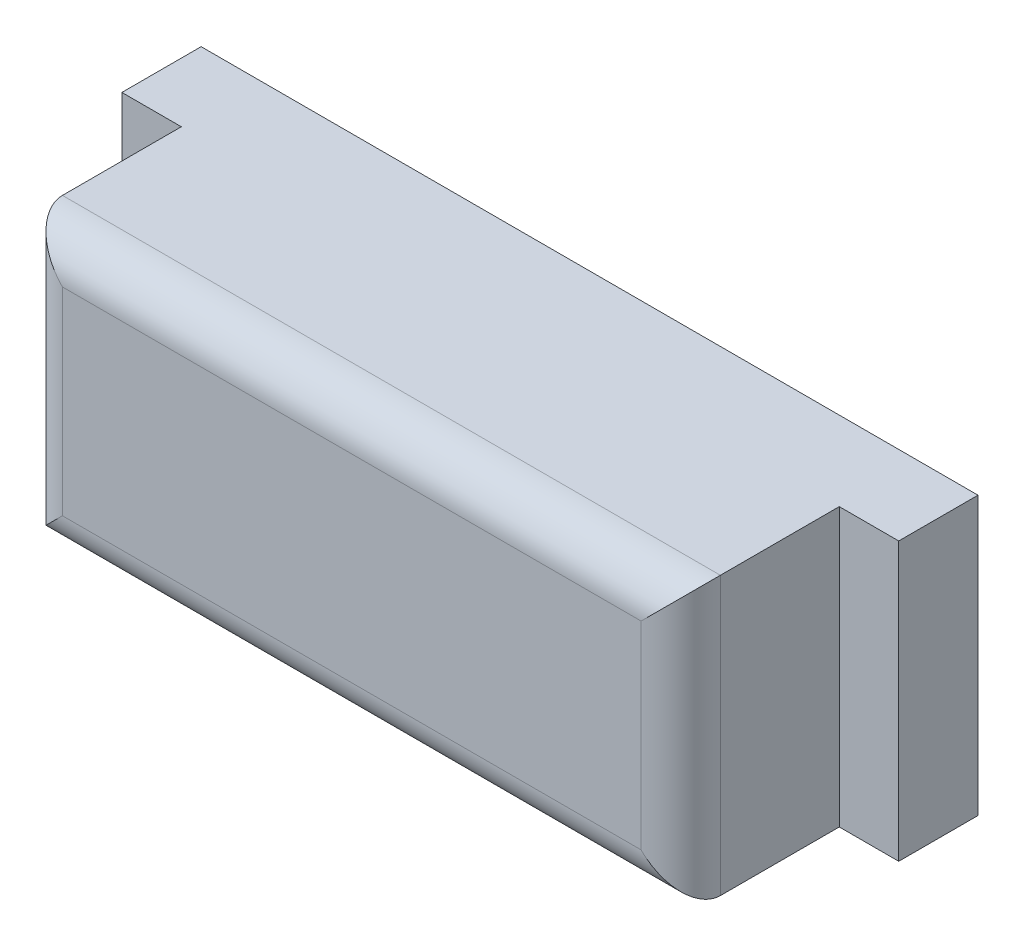
ISO-10303-21;
HEADER;
FILE_DESCRIPTION(('STEP AP214'),'2;1');
FILE_NAME('part.step','',(''),(''),'','','');
FILE_SCHEMA(('AUTOMOTIVE_DESIGN { 1 0 10303 214 1 1 1 1 }'));
ENDSEC;
DATA;
#1=APPLICATION_CONTEXT('core data for automotive mechanical design processes');
#2=APPLICATION_PROTOCOL_DEFINITION('international standard','automotive_design',2000,#1);
#3=PRODUCT_CONTEXT('',#1,'mechanical');
#4=PRODUCT('Part','Part','',(#3));
#5=PRODUCT_RELATED_PRODUCT_CATEGORY('part','',(#4));
#6=PRODUCT_DEFINITION_FORMATION('','',#4);
#7=PRODUCT_DEFINITION_CONTEXT('part definition',#1,'design');
#8=PRODUCT_DEFINITION('design','',#6,#7);
#9=PRODUCT_DEFINITION_SHAPE('','',#8);
#10=(LENGTH_UNIT() NAMED_UNIT(*) SI_UNIT(.MILLI.,.METRE.));
#11=(NAMED_UNIT(*) PLANE_ANGLE_UNIT() SI_UNIT($,.RADIAN.));
#12=(NAMED_UNIT(*) SI_UNIT($,.STERADIAN.) SOLID_ANGLE_UNIT());
#13=UNCERTAINTY_MEASURE_WITH_UNIT(LENGTH_MEASURE(1.E-05),#10,'distance_accuracy_value','');
#14=(GEOMETRIC_REPRESENTATION_CONTEXT(3) GLOBAL_UNCERTAINTY_ASSIGNED_CONTEXT((#13)) GLOBAL_UNIT_ASSIGNED_CONTEXT((#10,
#11,#12)) REPRESENTATION_CONTEXT('',''));
#15=CARTESIAN_POINT('',(0.,0.,0.));
#16=DIRECTION('',(0.,0.,1.));
#17=DIRECTION('',(1.,0.,0.));
#18=AXIS2_PLACEMENT_3D('',#15,#16,#17);
#19=CARTESIAN_POINT('',(0.,0.,1.));
#20=DIRECTION('',(0.,0.,1.));
#21=DIRECTION('',(1.,0.,0.));
#22=AXIS2_PLACEMENT_3D('',#19,#20,#21);
#23=PLANE('',#22);
#24=DIRECTION('',(0.,1.,0.));
#25=VECTOR('',#24,1.);
#26=CARTESIAN_POINT('',(4.15,1.75,1.));
#27=LINE('',#26,#25);
#28=CARTESIAN_POINT('',(4.15,-1.75,1.));
#29=VERTEX_POINT('',#28);
#30=CARTESIAN_POINT('',(4.15,1.75,1.));
#31=VERTEX_POINT('',#30);
#32=EDGE_CURVE('E146',#29,#31,#27,.T.);
#33=ORIENTED_EDGE('',*,*,#32,.F.);
#34=DIRECTION('',(1.,0.,0.));
#35=VECTOR('',#34,1.);
#36=CARTESIAN_POINT('',(-4.9,-1.75,1.));
#37=LINE('',#36,#35);
#38=CARTESIAN_POINT('',(4.9,-1.75,1.));
#39=VERTEX_POINT('',#38);
#40=EDGE_CURVE('E142',#29,#39,#37,.T.);
#41=ORIENTED_EDGE('',*,*,#40,.T.);
#42=DIRECTION('',(0.,1.,0.));
#43=VECTOR('',#42,1.);
#44=CARTESIAN_POINT('',(4.9,1.75,1.));
#45=LINE('',#44,#43);
#46=CARTESIAN_POINT('',(4.9,1.75,1.));
#47=VERTEX_POINT('',#46);
#48=EDGE_CURVE('E160',#39,#47,#45,.T.);
#49=ORIENTED_EDGE('',*,*,#48,.T.);
#50=DIRECTION('',(-1.,0.,0.));
#51=VECTOR('',#50,1.);
#52=CARTESIAN_POINT('',(-4.9,1.75,1.));
#53=LINE('',#52,#51);
#54=EDGE_CURVE('E166',#47,#31,#53,.T.);
#55=ORIENTED_EDGE('',*,*,#54,.T.);
#56=EDGE_LOOP('',(#33,#41,#49,#55));
#57=FACE_BOUND('',#56,.T.);
#58=ADVANCED_FACE('F39',(#57),#23,.T.);
#59=CARTESIAN_POINT('',(4.9,1.75,1.));
#60=DIRECTION('',(-1.,0.,0.));
#61=DIRECTION('',(0.,-1.,0.));
#62=AXIS2_PLACEMENT_3D('',#59,#60,#61);
#63=PLANE('',#62);
#64=DIRECTION('',(0.,1.,0.));
#65=VECTOR('',#64,1.);
#66=CARTESIAN_POINT('',(4.9,1.75,0.));
#67=LINE('',#66,#65);
#68=CARTESIAN_POINT('',(4.9,-1.75,0.));
#69=VERTEX_POINT('',#68);
#70=CARTESIAN_POINT('',(4.9,1.75,0.));
#71=VERTEX_POINT('',#70);
#72=EDGE_CURVE('E159',#69,#71,#67,.T.);
#73=ORIENTED_EDGE('',*,*,#72,.T.);
#74=DIRECTION('',(0.,0.,-1.));
#75=VECTOR('',#74,1.);
#76=CARTESIAN_POINT('',(4.9,1.75,1.));
#77=LINE('',#76,#75);
#78=EDGE_CURVE('E193',#47,#71,#77,.T.);
#79=ORIENTED_EDGE('',*,*,#78,.F.);
#80=ORIENTED_EDGE('',*,*,#48,.F.);
#81=DIRECTION('',(0.,0.,-1.));
#82=VECTOR('',#81,1.);
#83=CARTESIAN_POINT('',(4.9,-1.75,1.));
#84=LINE('',#83,#82);
#85=EDGE_CURVE('E141',#39,#69,#84,.T.);
#86=ORIENTED_EDGE('',*,*,#85,.T.);
#87=EDGE_LOOP('',(#73,#79,#80,#86));
#88=FACE_BOUND('',#87,.T.);
#89=ADVANCED_FACE('F255',(#88),#63,.F.);
#90=CARTESIAN_POINT('',(-4.9,1.75,1.));
#91=DIRECTION('',(0.,-1.,0.));
#92=DIRECTION('',(0.,0.,-1.));
#93=AXIS2_PLACEMENT_3D('',#90,#91,#92);
#94=PLANE('',#93);
#95=DIRECTION('',(0.,0.,-1.));
#96=VECTOR('',#95,1.);
#97=CARTESIAN_POINT('',(-4.15,1.75,3.));
#98=LINE('',#97,#96);
#99=CARTESIAN_POINT('',(-4.15,1.75,2.5));
#100=VERTEX_POINT('',#99);
#101=CARTESIAN_POINT('',(-4.15,1.75,1.));
#102=VERTEX_POINT('',#101);
#103=EDGE_CURVE('E129',#100,#102,#98,.T.);
#104=ORIENTED_EDGE('',*,*,#103,.F.);
#105=DIRECTION('',(-1.,0.,0.));
#106=VECTOR('',#105,1.);
#107=CARTESIAN_POINT('',(4.15,1.75,2.5));
#108=LINE('',#107,#106);
#109=CARTESIAN_POINT('',(4.15,1.75,2.5));
#110=VERTEX_POINT('',#109);
#111=EDGE_CURVE('E49',#100,#110,#108,.F.);
#112=ORIENTED_EDGE('',*,*,#111,.T.);
#113=DIRECTION('',(0.,0.,-1.));
#114=VECTOR('',#113,1.);
#115=CARTESIAN_POINT('',(4.15,1.75,3.));
#116=LINE('',#115,#114);
#117=EDGE_CURVE('E156',#110,#31,#116,.T.);
#118=ORIENTED_EDGE('',*,*,#117,.T.);
#119=ORIENTED_EDGE('',*,*,#54,.F.);
#120=ORIENTED_EDGE('',*,*,#78,.T.);
#121=DIRECTION('',(-1.,0.,0.));
#122=VECTOR('',#121,1.);
#123=CARTESIAN_POINT('',(-4.9,1.75,0.));
#124=LINE('',#123,#122);
#125=CARTESIAN_POINT('',(-4.9,1.75,0.));
#126=VERTEX_POINT('',#125);
#127=EDGE_CURVE('E175',#71,#126,#124,.T.);
#128=ORIENTED_EDGE('',*,*,#127,.T.);
#129=DIRECTION('',(0.,0.,-1.));
#130=VECTOR('',#129,1.);
#131=CARTESIAN_POINT('',(-4.9,1.75,1.));
#132=LINE('',#131,#130);
#133=CARTESIAN_POINT('',(-4.9,1.75,1.));
#134=VERTEX_POINT('',#133);
#135=EDGE_CURVE('E189',#134,#126,#132,.T.);
#136=ORIENTED_EDGE('',*,*,#135,.F.);
#137=EDGE_CURVE('E164',#102,#134,#53,.T.);
#138=ORIENTED_EDGE('',*,*,#137,.F.);
#139=EDGE_LOOP('',(#104,#112,#118,#119,#120,#128,#136,#138));
#140=FACE_BOUND('',#139,.T.);
#141=ADVANCED_FACE('F242',(#140),#94,.F.);
#142=CARTESIAN_POINT('',(-4.9,1.75,1.));
#143=DIRECTION('',(1.,0.,0.));
#144=DIRECTION('',(0.,0.,-1.));
#145=AXIS2_PLACEMENT_3D('',#142,#143,#144);
#146=PLANE('',#145);
#147=DIRECTION('',(0.,-1.,0.));
#148=VECTOR('',#147,1.);
#149=CARTESIAN_POINT('',(-4.9,1.75,0.));
#150=LINE('',#149,#148);
#151=CARTESIAN_POINT('',(-4.9,-1.75,0.));
#152=VERTEX_POINT('',#151);
#153=EDGE_CURVE('E178',#126,#152,#150,.T.);
#154=ORIENTED_EDGE('',*,*,#153,.T.);
#155=DIRECTION('',(0.,0.,-1.));
#156=VECTOR('',#155,1.);
#157=CARTESIAN_POINT('',(-4.9,-1.75,1.));
#158=LINE('',#157,#156);
#159=CARTESIAN_POINT('',(-4.9,-1.75,1.));
#160=VERTEX_POINT('',#159);
#161=EDGE_CURVE('E186',#160,#152,#158,.T.);
#162=ORIENTED_EDGE('',*,*,#161,.F.);
#163=DIRECTION('',(0.,-1.,0.));
#164=VECTOR('',#163,1.);
#165=CARTESIAN_POINT('',(-4.9,1.75,1.));
#166=LINE('',#165,#164);
#167=EDGE_CURVE('E138',#134,#160,#166,.T.);
#168=ORIENTED_EDGE('',*,*,#167,.F.);
#169=ORIENTED_EDGE('',*,*,#135,.T.);
#170=EDGE_LOOP('',(#154,#162,#168,#169));
#171=FACE_BOUND('',#170,.T.);
#172=ADVANCED_FACE('F278',(#171),#146,.F.);
#173=CARTESIAN_POINT('',(-4.9,-1.75,1.));
#174=DIRECTION('',(0.,1.,0.));
#175=DIRECTION('',(0.,0.,1.));
#176=AXIS2_PLACEMENT_3D('',#173,#174,#175);
#177=PLANE('',#176);
#178=DIRECTION('',(0.,0.,-1.));
#179=VECTOR('',#178,1.);
#180=CARTESIAN_POINT('',(4.15,-1.75,3.));
#181=LINE('',#180,#179);
#182=CARTESIAN_POINT('',(4.15,-1.75,2.5));
#183=VERTEX_POINT('',#182);
#184=EDGE_CURVE('E130',#183,#29,#181,.T.);
#185=ORIENTED_EDGE('',*,*,#184,.F.);
#186=DIRECTION('',(1.,0.,0.));
#187=VECTOR('',#186,1.);
#188=CARTESIAN_POINT('',(-4.15,-1.75,2.5));
#189=LINE('',#188,#187);
#190=CARTESIAN_POINT('',(-4.15,-1.75,2.5));
#191=VERTEX_POINT('',#190);
#192=EDGE_CURVE('E123',#183,#191,#189,.F.);
#193=ORIENTED_EDGE('',*,*,#192,.T.);
#194=DIRECTION('',(0.,0.,-1.));
#195=VECTOR('',#194,1.);
#196=CARTESIAN_POINT('',(-4.15,-1.75,3.));
#197=LINE('',#196,#195);
#198=CARTESIAN_POINT('',(-4.15,-1.75,1.));
#199=VERTEX_POINT('',#198);
#200=EDGE_CURVE('E117',#191,#199,#197,.T.);
#201=ORIENTED_EDGE('',*,*,#200,.T.);
#202=EDGE_CURVE('E121',#160,#199,#37,.T.);
#203=ORIENTED_EDGE('',*,*,#202,.F.);
#204=ORIENTED_EDGE('',*,*,#161,.T.);
#205=DIRECTION('',(1.,0.,0.));
#206=VECTOR('',#205,1.);
#207=CARTESIAN_POINT('',(-4.9,-1.75,0.));
#208=LINE('',#207,#206);
#209=EDGE_CURVE('E165',#152,#69,#208,.T.);
#210=ORIENTED_EDGE('',*,*,#209,.T.);
#211=ORIENTED_EDGE('',*,*,#85,.F.);
#212=ORIENTED_EDGE('',*,*,#40,.F.);
#213=EDGE_LOOP('',(#185,#193,#201,#203,#204,#210,#211,#212));
#214=FACE_BOUND('',#213,.T.);
#215=ADVANCED_FACE('F119',(#214),#177,.F.);
#216=DIRECTION('',(0.,-1.,0.));
#217=VECTOR('',#216,1.);
#218=CARTESIAN_POINT('',(-4.15,1.75,1.));
#219=LINE('',#218,#217);
#220=EDGE_CURVE('E135',#102,#199,#219,.T.);
#221=ORIENTED_EDGE('',*,*,#220,.F.);
#222=ORIENTED_EDGE('',*,*,#137,.T.);
#223=ORIENTED_EDGE('',*,*,#167,.T.);
#224=ORIENTED_EDGE('',*,*,#202,.T.);
#225=EDGE_LOOP('',(#221,#222,#223,#224));
#226=FACE_BOUND('',#225,.T.);
#227=ADVANCED_FACE('F134',(#226),#23,.T.);
#228=CARTESIAN_POINT('',(0.,0.,0.));
#229=DIRECTION('',(0.,0.,1.));
#230=DIRECTION('',(1.,0.,0.));
#231=AXIS2_PLACEMENT_3D('',#228,#229,#230);
#232=PLANE('',#231);
#233=ORIENTED_EDGE('',*,*,#72,.F.);
#234=ORIENTED_EDGE('',*,*,#209,.F.);
#235=ORIENTED_EDGE('',*,*,#153,.F.);
#236=ORIENTED_EDGE('',*,*,#127,.F.);
#237=EDGE_LOOP('',(#233,#234,#235,#236));
#238=FACE_BOUND('',#237,.T.);
#239=ADVANCED_FACE('F258',(#238),#232,.F.);
#240=CARTESIAN_POINT('',(4.15,1.75,3.));
#241=DIRECTION('',(-1.,0.,0.));
#242=DIRECTION('',(0.,0.,1.));
#243=AXIS2_PLACEMENT_3D('',#240,#241,#242);
#244=PLANE('',#243);
#245=ORIENTED_EDGE('',*,*,#117,.F.);
#246=DIRECTION('',(0.,1.,0.));
#247=VECTOR('',#246,1.);
#248=CARTESIAN_POINT('',(4.15,-1.75,2.5));
#249=LINE('',#248,#247);
#250=EDGE_CURVE('E11',#110,#183,#249,.F.);
#251=ORIENTED_EDGE('',*,*,#250,.T.);
#252=ORIENTED_EDGE('',*,*,#184,.T.);
#253=ORIENTED_EDGE('',*,*,#32,.T.);
#254=EDGE_LOOP('',(#245,#251,#252,#253));
#255=FACE_BOUND('',#254,.T.);
#256=ADVANCED_FACE('F256',(#255),#244,.F.);
#257=CARTESIAN_POINT('',(-4.15,1.75,3.));
#258=DIRECTION('',(1.,0.,0.));
#259=DIRECTION('',(0.,0.,-1.));
#260=AXIS2_PLACEMENT_3D('',#257,#258,#259);
#261=PLANE('',#260);
#262=ORIENTED_EDGE('',*,*,#200,.F.);
#263=DIRECTION('',(0.,-1.,0.));
#264=VECTOR('',#263,1.);
#265=CARTESIAN_POINT('',(-4.15,1.75,2.5));
#266=LINE('',#265,#264);
#267=EDGE_CURVE('E210',#191,#100,#266,.F.);
#268=ORIENTED_EDGE('',*,*,#267,.T.);
#269=ORIENTED_EDGE('',*,*,#103,.T.);
#270=ORIENTED_EDGE('',*,*,#220,.T.);
#271=EDGE_LOOP('',(#262,#268,#269,#270));
#272=FACE_BOUND('',#271,.T.);
#273=ADVANCED_FACE('F144',(#272),#261,.F.);
#274=CARTESIAN_POINT('',(0.,0.,3.));
#275=DIRECTION('',(0.,0.,1.));
#276=DIRECTION('',(1.,0.,0.));
#277=AXIS2_PLACEMENT_3D('',#274,#275,#276);
#278=PLANE('',#277);
#279=DIRECTION('',(-1.,0.,0.));
#280=VECTOR('',#279,1.);
#281=CARTESIAN_POINT('',(-4.15,1.25,3.));
#282=LINE('',#281,#280);
#283=CARTESIAN_POINT('',(3.65,1.25,3.));
#284=VERTEX_POINT('',#283);
#285=CARTESIAN_POINT('',(-3.65,1.25,3.));
#286=VERTEX_POINT('',#285);
#287=EDGE_CURVE('E200',#284,#286,#282,.T.);
#288=ORIENTED_EDGE('',*,*,#287,.T.);
#289=DIRECTION('',(0.,-1.,0.));
#290=VECTOR('',#289,1.);
#291=CARTESIAN_POINT('',(-3.65,-1.75,3.));
#292=LINE('',#291,#290);
#293=CARTESIAN_POINT('',(-3.65,-1.25,3.));
#294=VERTEX_POINT('',#293);
#295=EDGE_CURVE('E206',#286,#294,#292,.T.);
#296=ORIENTED_EDGE('',*,*,#295,.T.);
#297=DIRECTION('',(1.,0.,0.));
#298=VECTOR('',#297,1.);
#299=CARTESIAN_POINT('',(4.15,-1.25,3.));
#300=LINE('',#299,#298);
#301=CARTESIAN_POINT('',(3.65,-1.25,3.));
#302=VERTEX_POINT('',#301);
#303=EDGE_CURVE('E203',#294,#302,#300,.T.);
#304=ORIENTED_EDGE('',*,*,#303,.T.);
#305=DIRECTION('',(0.,1.,0.));
#306=VECTOR('',#305,1.);
#307=CARTESIAN_POINT('',(3.65,1.75,3.));
#308=LINE('',#307,#306);
#309=EDGE_CURVE('E197',#302,#284,#308,.T.);
#310=ORIENTED_EDGE('',*,*,#309,.T.);
#311=EDGE_LOOP('',(#288,#296,#304,#310));
#312=FACE_BOUND('',#311,.T.);
#313=ADVANCED_FACE('F264',(#312),#278,.T.);
#314=CARTESIAN_POINT('',(3.65,0.,2.5));
#315=DIRECTION('',(0.,-1.,0.));
#316=DIRECTION('',(0.,0.,-1.));
#317=AXIS2_PLACEMENT_3D('',#314,#315,#316);
#318=CYLINDRICAL_SURFACE('',#317,0.5);
#319=CARTESIAN_POINT('',(3.65,-1.25,2.5));
#320=DIRECTION('',(-0.707106781186547,-0.707106781186547,0.));
#321=DIRECTION('',(0.707106781186547,-0.707106781186547,0.));
#322=AXIS2_PLACEMENT_3D('',#319,#320,#321);
#323=ELLIPSE('',#322,0.707106781186547,0.5);
#324=EDGE_CURVE('E222',#183,#302,#323,.T.);
#325=ORIENTED_EDGE('',*,*,#324,.F.);
#326=ORIENTED_EDGE('',*,*,#250,.F.);
#327=CARTESIAN_POINT('',(3.65,1.25,2.5));
#328=DIRECTION('',(0.707106781186547,-0.707106781186547,0.));
#329=DIRECTION('',(-0.707106781186547,-0.707106781186547,0.));
#330=AXIS2_PLACEMENT_3D('',#327,#328,#329);
#331=ELLIPSE('',#330,0.707106781186547,0.5);
#332=EDGE_CURVE('E43',#284,#110,#331,.F.);
#333=ORIENTED_EDGE('',*,*,#332,.F.);
#334=ORIENTED_EDGE('',*,*,#309,.F.);
#335=EDGE_LOOP('',(#325,#326,#333,#334));
#336=FACE_BOUND('',#335,.T.);
#337=ADVANCED_FACE('F41',(#336),#318,.T.);
#338=CARTESIAN_POINT('',(0.,1.25,2.5));
#339=DIRECTION('',(1.,0.,0.));
#340=DIRECTION('',(0.,0.,-1.));
#341=AXIS2_PLACEMENT_3D('',#338,#339,#340);
#342=CYLINDRICAL_SURFACE('',#341,0.5);
#343=ORIENTED_EDGE('',*,*,#332,.T.);
#344=ORIENTED_EDGE('',*,*,#111,.F.);
#345=CARTESIAN_POINT('',(-3.65,1.25,2.5));
#346=DIRECTION('',(0.707106781186547,0.707106781186547,0.));
#347=DIRECTION('',(0.707106781186547,-0.707106781186547,0.));
#348=AXIS2_PLACEMENT_3D('',#345,#346,#347);
#349=ELLIPSE('',#348,0.707106781186547,0.5);
#350=EDGE_CURVE('E220',#286,#100,#349,.F.);
#351=ORIENTED_EDGE('',*,*,#350,.F.);
#352=ORIENTED_EDGE('',*,*,#287,.F.);
#353=EDGE_LOOP('',(#343,#344,#351,#352));
#354=FACE_BOUND('',#353,.T.);
#355=ADVANCED_FACE('F233',(#354),#342,.T.);
#356=CARTESIAN_POINT('',(0.,-1.25,2.5));
#357=DIRECTION('',(-1.,0.,0.));
#358=DIRECTION('',(0.,0.,1.));
#359=AXIS2_PLACEMENT_3D('',#356,#357,#358);
#360=CYLINDRICAL_SURFACE('',#359,0.5);
#361=ORIENTED_EDGE('',*,*,#324,.T.);
#362=ORIENTED_EDGE('',*,*,#303,.F.);
#363=CARTESIAN_POINT('',(-3.65,-1.25,2.5));
#364=DIRECTION('',(-0.707106781186547,0.707106781186547,0.));
#365=DIRECTION('',(-0.707106781186547,-0.707106781186547,0.));
#366=AXIS2_PLACEMENT_3D('',#363,#364,#365);
#367=ELLIPSE('',#366,0.707106781186547,0.5);
#368=EDGE_CURVE('E217',#191,#294,#367,.T.);
#369=ORIENTED_EDGE('',*,*,#368,.F.);
#370=ORIENTED_EDGE('',*,*,#192,.F.);
#371=EDGE_LOOP('',(#361,#362,#369,#370));
#372=FACE_BOUND('',#371,.T.);
#373=ADVANCED_FACE('F238',(#372),#360,.T.);
#374=CARTESIAN_POINT('',(-3.65,0.,2.5));
#375=DIRECTION('',(0.,1.,0.));
#376=DIRECTION('',(0.,0.,1.));
#377=AXIS2_PLACEMENT_3D('',#374,#375,#376);
#378=CYLINDRICAL_SURFACE('',#377,0.5);
#379=ORIENTED_EDGE('',*,*,#350,.T.);
#380=ORIENTED_EDGE('',*,*,#267,.F.);
#381=ORIENTED_EDGE('',*,*,#368,.T.);
#382=ORIENTED_EDGE('',*,*,#295,.F.);
#383=EDGE_LOOP('',(#379,#380,#381,#382));
#384=FACE_BOUND('',#383,.T.);
#385=ADVANCED_FACE('F241',(#384),#378,.T.);
#386=CLOSED_SHELL('',(#58,#89,#141,#172,#215,#227,#239,#256,#273,#313,#337,#355,#373,#385));
#387=MANIFOLD_SOLID_BREP('B2',#386);
#388=ADVANCED_BREP_SHAPE_REPRESENTATION('',(#18,#387),#14);
#389=SHAPE_DEFINITION_REPRESENTATION(#9,#388);
ENDSEC;
END-ISO-10303-21;
